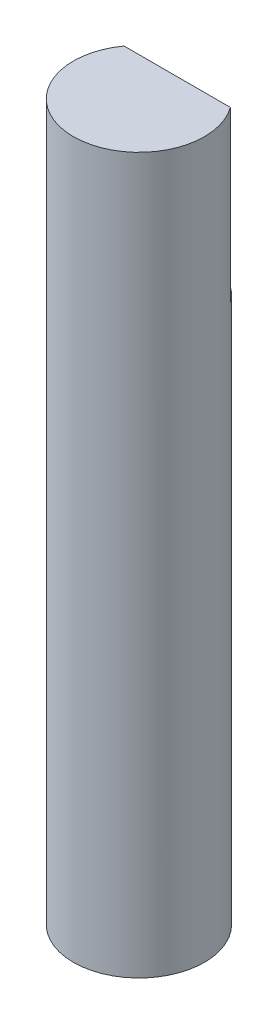
ISO-10303-21;
HEADER;
FILE_DESCRIPTION(('STEP AP214'),'2;1');
FILE_NAME('part.step','',(''),(''),'','','');
FILE_SCHEMA(('AUTOMOTIVE_DESIGN { 1 0 10303 214 1 1 1 1 }'));
ENDSEC;
DATA;
#1=APPLICATION_CONTEXT('core data for automotive mechanical design processes');
#2=APPLICATION_PROTOCOL_DEFINITION('international standard','automotive_design',2000,#1);
#3=PRODUCT_CONTEXT('',#1,'mechanical');
#4=PRODUCT('Part','Part','',(#3));
#5=PRODUCT_RELATED_PRODUCT_CATEGORY('part','',(#4));
#6=PRODUCT_DEFINITION_FORMATION('','',#4);
#7=PRODUCT_DEFINITION_CONTEXT('part definition',#1,'design');
#8=PRODUCT_DEFINITION('design','',#6,#7);
#9=PRODUCT_DEFINITION_SHAPE('','',#8);
#10=(LENGTH_UNIT() NAMED_UNIT(*) SI_UNIT(.MILLI.,.METRE.));
#11=(NAMED_UNIT(*) PLANE_ANGLE_UNIT() SI_UNIT($,.RADIAN.));
#12=(NAMED_UNIT(*) SI_UNIT($,.STERADIAN.) SOLID_ANGLE_UNIT());
#13=UNCERTAINTY_MEASURE_WITH_UNIT(LENGTH_MEASURE(1.E-05),#10,'distance_accuracy_value','');
#14=(GEOMETRIC_REPRESENTATION_CONTEXT(3) GLOBAL_UNCERTAINTY_ASSIGNED_CONTEXT((#13)) GLOBAL_UNIT_ASSIGNED_CONTEXT((#10,
#11,#12)) REPRESENTATION_CONTEXT('',''));
#15=CARTESIAN_POINT('',(0.,0.,0.));
#16=DIRECTION('',(0.,0.,1.));
#17=DIRECTION('',(1.,0.,0.));
#18=AXIS2_PLACEMENT_3D('',#15,#16,#17);
#19=CARTESIAN_POINT('',(0.,42.,0.));
#20=DIRECTION('',(0.,-1.,0.));
#21=DIRECTION('',(0.,0.,-1.));
#22=AXIS2_PLACEMENT_3D('',#19,#20,#21);
#23=CYLINDRICAL_SURFACE('',#22,3.85);
#24=CARTESIAN_POINT('',(0.,42.,0.));
#25=DIRECTION('',(0.,1.,0.));
#26=DIRECTION('',(0.,0.,1.));
#27=AXIS2_PLACEMENT_3D('',#24,#25,#26);
#28=CIRCLE('',#27,3.85);
#29=CARTESIAN_POINT('',(-3.12409987036266,42.,-2.25));
#30=VERTEX_POINT('',#29);
#31=CARTESIAN_POINT('',(3.12409987036266,42.,-2.25));
#32=VERTEX_POINT('',#31);
#33=EDGE_CURVE('E11',#30,#32,#28,.T.);
#34=ORIENTED_EDGE('',*,*,#33,.F.);
#35=DIRECTION('',(0.,1.,0.));
#36=VECTOR('',#35,1.);
#37=CARTESIAN_POINT('',(-3.12409987036266,32.,-2.25));
#38=LINE('',#37,#36);
#39=CARTESIAN_POINT('',(-3.12409987036266,32.,-2.25));
#40=VERTEX_POINT('',#39);
#41=EDGE_CURVE('E51',#40,#30,#38,.T.);
#42=ORIENTED_EDGE('',*,*,#41,.F.);
#43=CARTESIAN_POINT('',(0.,32.,0.));
#44=DIRECTION('',(0.,1.,0.));
#45=DIRECTION('',(0.,0.,1.));
#46=AXIS2_PLACEMENT_3D('',#43,#44,#45);
#47=CIRCLE('',#46,3.85);
#48=CARTESIAN_POINT('',(3.12409987036266,32.,-2.25));
#49=VERTEX_POINT('',#48);
#50=EDGE_CURVE('E71',#49,#40,#47,.T.);
#51=ORIENTED_EDGE('',*,*,#50,.F.);
#52=DIRECTION('',(0.,1.,0.));
#53=VECTOR('',#52,1.);
#54=CARTESIAN_POINT('',(3.12409987036266,32.,-2.25));
#55=LINE('',#54,#53);
#56=EDGE_CURVE('E64',#49,#32,#55,.T.);
#57=ORIENTED_EDGE('',*,*,#56,.T.);
#58=EDGE_LOOP('',(#34,#42,#51,#57));
#59=FACE_BOUND('',#58,.T.);
#60=CARTESIAN_POINT('',(0.,0.,0.));
#61=DIRECTION('',(0.,1.,0.));
#62=DIRECTION('',(0.,0.,1.));
#63=AXIS2_PLACEMENT_3D('',#60,#61,#62);
#64=CIRCLE('',#63,3.85);
#65=CARTESIAN_POINT('',(0.,0.,3.85));
#66=VERTEX_POINT('',#65);
#67=EDGE_CURVE('E40',#66,#66,#64,.T.);
#68=ORIENTED_EDGE('',*,*,#67,.T.);
#69=EDGE_LOOP('',(#68));
#70=FACE_BOUND('',#69,.T.);
#71=ADVANCED_FACE('F37',(#59,#70),#23,.T.);
#72=CARTESIAN_POINT('',(0.,42.,0.));
#73=DIRECTION('',(0.,1.,0.));
#74=DIRECTION('',(0.,0.,1.));
#75=AXIS2_PLACEMENT_3D('',#72,#73,#74);
#76=PLANE('',#75);
#77=DIRECTION('',(1.,0.,0.));
#78=VECTOR('',#77,1.);
#79=CARTESIAN_POINT('',(-3.12409987036266,42.,-2.25));
#80=LINE('',#79,#78);
#81=EDGE_CURVE('E61',#30,#32,#80,.T.);
#82=ORIENTED_EDGE('',*,*,#81,.F.);
#83=ORIENTED_EDGE('',*,*,#33,.T.);
#84=EDGE_LOOP('',(#82,#83));
#85=FACE_BOUND('',#84,.T.);
#86=ADVANCED_FACE('F73',(#85),#76,.T.);
#87=CARTESIAN_POINT('',(0.,0.,0.));
#88=DIRECTION('',(0.,1.,0.));
#89=DIRECTION('',(0.,0.,1.));
#90=AXIS2_PLACEMENT_3D('',#87,#88,#89);
#91=PLANE('',#90);
#92=ORIENTED_EDGE('',*,*,#67,.F.);
#93=EDGE_LOOP('',(#92));
#94=FACE_BOUND('',#93,.T.);
#95=ADVANCED_FACE('F75',(#94),#91,.F.);
#96=CARTESIAN_POINT('',(-3.12409987036266,32.,-2.25));
#97=DIRECTION('',(0.,0.,1.));
#98=DIRECTION('',(1.,0.,0.));
#99=AXIS2_PLACEMENT_3D('',#96,#97,#98);
#100=PLANE('',#99);
#101=ORIENTED_EDGE('',*,*,#81,.T.);
#102=ORIENTED_EDGE('',*,*,#56,.F.);
#103=DIRECTION('',(1.,0.,0.));
#104=VECTOR('',#103,1.);
#105=CARTESIAN_POINT('',(-3.12409987036266,32.,-2.25));
#106=LINE('',#105,#104);
#107=EDGE_CURVE('E57',#40,#49,#106,.T.);
#108=ORIENTED_EDGE('',*,*,#107,.F.);
#109=ORIENTED_EDGE('',*,*,#41,.T.);
#110=EDGE_LOOP('',(#101,#102,#108,#109));
#111=FACE_BOUND('',#110,.T.);
#112=ADVANCED_FACE('F63',(#111),#100,.F.);
#113=CARTESIAN_POINT('',(0.,32.,0.));
#114=DIRECTION('',(0.,1.,0.));
#115=DIRECTION('',(0.,0.,1.));
#116=AXIS2_PLACEMENT_3D('',#113,#114,#115);
#117=PLANE('',#116);
#118=ORIENTED_EDGE('',*,*,#107,.T.);
#119=ORIENTED_EDGE('',*,*,#50,.T.);
#120=EDGE_LOOP('',(#118,#119));
#121=FACE_BOUND('',#120,.T.);
#122=ADVANCED_FACE('F85',(#121),#117,.T.);
#123=CLOSED_SHELL('',(#71,#86,#95,#112,#122));
#124=MANIFOLD_SOLID_BREP('B2',#123);
#125=ADVANCED_BREP_SHAPE_REPRESENTATION('',(#18,#124),#14);
#126=SHAPE_DEFINITION_REPRESENTATION(#9,#125);
ENDSEC;
END-ISO-10303-21;
